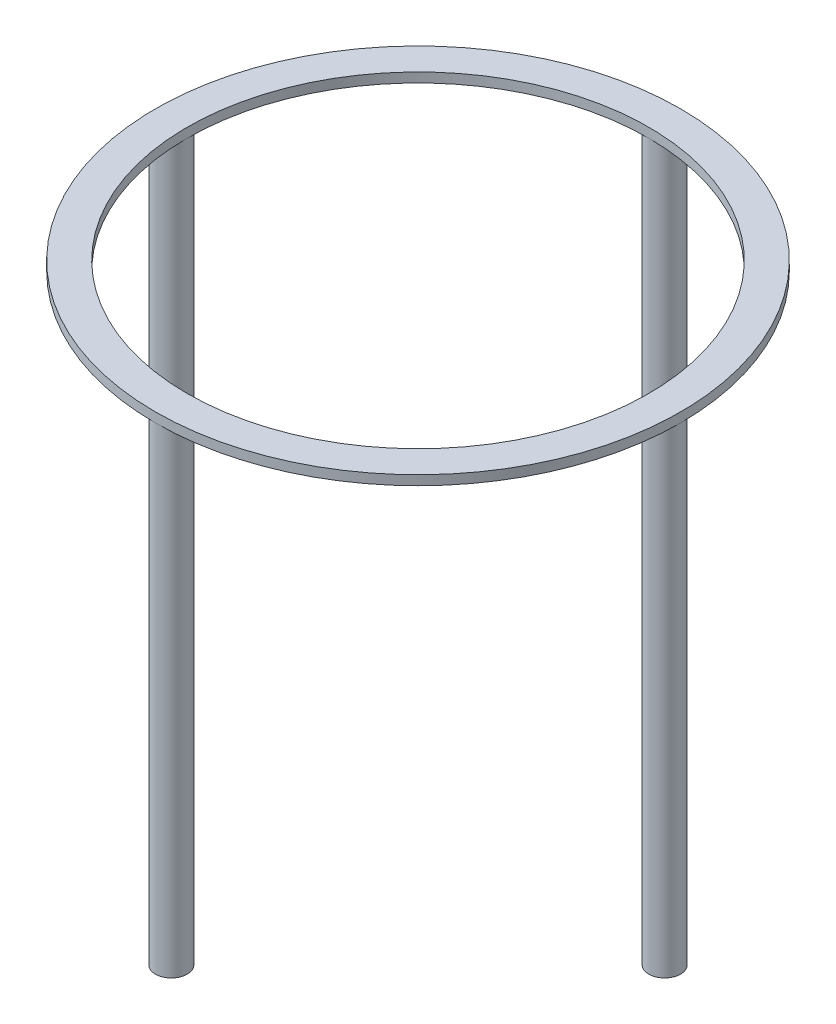
ISO-10303-21;
HEADER;
FILE_DESCRIPTION(('STEP AP214'),'2;1');
FILE_NAME('part.step','',(''),(''),'','','');
FILE_SCHEMA(('AUTOMOTIVE_DESIGN { 1 0 10303 214 1 1 1 1 }'));
ENDSEC;
DATA;
#1=APPLICATION_CONTEXT('core data for automotive mechanical design processes');
#2=APPLICATION_PROTOCOL_DEFINITION('international standard','automotive_design',2000,#1);
#3=PRODUCT_CONTEXT('',#1,'mechanical');
#4=PRODUCT('Part','Part','',(#3));
#5=PRODUCT_RELATED_PRODUCT_CATEGORY('part','',(#4));
#6=PRODUCT_DEFINITION_FORMATION('','',#4);
#7=PRODUCT_DEFINITION_CONTEXT('part definition',#1,'design');
#8=PRODUCT_DEFINITION('design','',#6,#7);
#9=PRODUCT_DEFINITION_SHAPE('','',#8);
#10=(LENGTH_UNIT() NAMED_UNIT(*) SI_UNIT(.MILLI.,.METRE.));
#11=(NAMED_UNIT(*) PLANE_ANGLE_UNIT() SI_UNIT($,.RADIAN.));
#12=(NAMED_UNIT(*) SI_UNIT($,.STERADIAN.) SOLID_ANGLE_UNIT());
#13=UNCERTAINTY_MEASURE_WITH_UNIT(LENGTH_MEASURE(1.E-05),#10,'distance_accuracy_value','');
#14=(GEOMETRIC_REPRESENTATION_CONTEXT(3) GLOBAL_UNCERTAINTY_ASSIGNED_CONTEXT((#13)) GLOBAL_UNIT_ASSIGNED_CONTEXT((#10,
#11,#12)) REPRESENTATION_CONTEXT('',''));
#15=CARTESIAN_POINT('',(0.,0.,0.));
#16=DIRECTION('',(0.,0.,1.));
#17=DIRECTION('',(1.,0.,0.));
#18=AXIS2_PLACEMENT_3D('',#15,#16,#17);
#19=CARTESIAN_POINT('',(0.,0.,0.));
#20=DIRECTION('',(0.,1.,0.));
#21=DIRECTION('',(0.,0.,1.));
#22=AXIS2_PLACEMENT_3D('',#19,#20,#21);
#23=PLANE('',#22);
#24=CARTESIAN_POINT('',(0.,0.,0.));
#25=DIRECTION('',(0.,1.,0.));
#26=DIRECTION('',(0.,0.,1.));
#27=AXIS2_PLACEMENT_3D('',#24,#25,#26);
#28=CIRCLE('',#27,72.5);
#29=CARTESIAN_POINT('',(0.,0.,-72.5));
#30=VERTEX_POINT('',#29);
#31=CARTESIAN_POINT('',(-72.5,0.,0.));
#32=VERTEX_POINT('',#31);
#33=EDGE_CURVE('E140',#30,#32,#28,.T.);
#34=ORIENTED_EDGE('',*,*,#33,.T.);
#35=CARTESIAN_POINT('',(-77.5,0.,0.));
#36=DIRECTION('',(0.,1.,0.));
#37=DIRECTION('',(0.,0.,1.));
#38=AXIS2_PLACEMENT_3D('',#35,#36,#37);
#39=CIRCLE('',#38,5.);
#40=CARTESIAN_POINT('',(-82.5,0.,0.));
#41=VERTEX_POINT('',#40);
#42=EDGE_CURVE('E54',#32,#41,#39,.T.);
#43=ORIENTED_EDGE('',*,*,#42,.T.);
#44=CARTESIAN_POINT('',(0.,0.,0.));
#45=DIRECTION('',(0.,1.,0.));
#46=DIRECTION('',(0.,0.,1.));
#47=AXIS2_PLACEMENT_3D('',#44,#45,#46);
#48=CIRCLE('',#47,82.5);
#49=CARTESIAN_POINT('',(0.,0.,-82.5));
#50=VERTEX_POINT('',#49);
#51=EDGE_CURVE('E104',#50,#41,#48,.T.);
#52=ORIENTED_EDGE('',*,*,#51,.F.);
#53=CARTESIAN_POINT('',(0.,0.,-77.5));
#54=DIRECTION('',(0.,1.,0.));
#55=DIRECTION('',(0.,0.,1.));
#56=AXIS2_PLACEMENT_3D('',#53,#54,#55);
#57=CIRCLE('',#56,5.);
#58=EDGE_CURVE('E82',#50,#30,#57,.T.);
#59=ORIENTED_EDGE('',*,*,#58,.T.);
#60=EDGE_LOOP('',(#34,#43,#52,#59));
#61=FACE_BOUND('',#60,.T.);
#62=ADVANCED_FACE('F42',(#61),#23,.F.);
#63=CARTESIAN_POINT('',(0.,0.,82.5));
#64=VERTEX_POINT('',#63);
#65=CARTESIAN_POINT('',(82.5,0.,0.));
#66=VERTEX_POINT('',#65);
#67=EDGE_CURVE('E48',#64,#66,#48,.T.);
#68=ORIENTED_EDGE('',*,*,#67,.F.);
#69=CARTESIAN_POINT('',(0.,0.,77.5));
#70=DIRECTION('',(0.,1.,0.));
#71=DIRECTION('',(0.,0.,1.));
#72=AXIS2_PLACEMENT_3D('',#69,#70,#71);
#73=CIRCLE('',#72,5.);
#74=CARTESIAN_POINT('',(0.,0.,72.5));
#75=VERTEX_POINT('',#74);
#76=EDGE_CURVE('E132',#64,#75,#73,.T.);
#77=ORIENTED_EDGE('',*,*,#76,.T.);
#78=CARTESIAN_POINT('',(72.5,0.,0.));
#79=VERTEX_POINT('',#78);
#80=EDGE_CURVE('E111',#75,#79,#28,.T.);
#81=ORIENTED_EDGE('',*,*,#80,.T.);
#82=CARTESIAN_POINT('',(77.5,0.,0.));
#83=DIRECTION('',(0.,1.,0.));
#84=DIRECTION('',(0.,0.,1.));
#85=AXIS2_PLACEMENT_3D('',#82,#83,#84);
#86=CIRCLE('',#85,5.);
#87=EDGE_CURVE('E90',#79,#66,#86,.T.);
#88=ORIENTED_EDGE('',*,*,#87,.T.);
#89=EDGE_LOOP('',(#68,#77,#81,#88));
#90=FACE_BOUND('',#89,.T.);
#91=ADVANCED_FACE('F146',(#90),#23,.F.);
#92=EDGE_CURVE('E98',#66,#50,#48,.T.);
#93=ORIENTED_EDGE('',*,*,#92,.F.);
#94=EDGE_CURVE('E127',#66,#79,#86,.T.);
#95=ORIENTED_EDGE('',*,*,#94,.T.);
#96=EDGE_CURVE('E101',#79,#30,#28,.T.);
#97=ORIENTED_EDGE('',*,*,#96,.T.);
#98=EDGE_CURVE('E68',#30,#50,#57,.T.);
#99=ORIENTED_EDGE('',*,*,#98,.T.);
#100=EDGE_LOOP('',(#93,#95,#97,#99));
#101=FACE_BOUND('',#100,.T.);
#102=ADVANCED_FACE('F92',(#101),#23,.F.);
#103=CARTESIAN_POINT('',(0.,3.,0.));
#104=DIRECTION('',(0.,1.,0.));
#105=DIRECTION('',(0.,0.,1.));
#106=AXIS2_PLACEMENT_3D('',#103,#104,#105);
#107=PLANE('',#106);
#108=CARTESIAN_POINT('',(0.,3.,0.));
#109=DIRECTION('',(0.,1.,0.));
#110=DIRECTION('',(0.,0.,1.));
#111=AXIS2_PLACEMENT_3D('',#108,#109,#110);
#112=CIRCLE('',#111,82.5);
#113=CARTESIAN_POINT('',(0.,3.,82.5));
#114=VERTEX_POINT('',#113);
#115=EDGE_CURVE('E89',#114,#114,#112,.T.);
#116=ORIENTED_EDGE('',*,*,#115,.T.);
#117=EDGE_LOOP('',(#116));
#118=FACE_BOUND('',#117,.T.);
#119=CARTESIAN_POINT('',(0.,3.,0.));
#120=DIRECTION('',(0.,1.,0.));
#121=DIRECTION('',(0.,0.,1.));
#122=AXIS2_PLACEMENT_3D('',#119,#120,#121);
#123=CIRCLE('',#122,72.5);
#124=CARTESIAN_POINT('',(0.,3.,72.5));
#125=VERTEX_POINT('',#124);
#126=EDGE_CURVE('E115',#125,#125,#123,.T.);
#127=ORIENTED_EDGE('',*,*,#126,.F.);
#128=EDGE_LOOP('',(#127));
#129=FACE_BOUND('',#128,.T.);
#130=ADVANCED_FACE('F174',(#118,#129),#107,.T.);
#131=EDGE_CURVE('E108',#41,#64,#48,.T.);
#132=ORIENTED_EDGE('',*,*,#131,.F.);
#133=EDGE_CURVE('E11',#41,#32,#39,.T.);
#134=ORIENTED_EDGE('',*,*,#133,.T.);
#135=EDGE_CURVE('E118',#32,#75,#28,.T.);
#136=ORIENTED_EDGE('',*,*,#135,.T.);
#137=EDGE_CURVE('E52',#75,#64,#73,.T.);
#138=ORIENTED_EDGE('',*,*,#137,.T.);
#139=EDGE_LOOP('',(#132,#134,#136,#138));
#140=FACE_BOUND('',#139,.T.);
#141=ADVANCED_FACE('F151',(#140),#23,.F.);
#142=CARTESIAN_POINT('',(0.,3.,0.));
#143=DIRECTION('',(0.,-1.,0.));
#144=DIRECTION('',(0.,0.,-1.));
#145=AXIS2_PLACEMENT_3D('',#142,#143,#144);
#146=CYLINDRICAL_SURFACE('',#145,82.5);
#147=ORIENTED_EDGE('',*,*,#115,.F.);
#148=EDGE_LOOP('',(#147));
#149=FACE_BOUND('',#148,.T.);
#150=ORIENTED_EDGE('',*,*,#67,.T.);
#151=ORIENTED_EDGE('',*,*,#92,.T.);
#152=ORIENTED_EDGE('',*,*,#51,.T.);
#153=ORIENTED_EDGE('',*,*,#131,.T.);
#154=EDGE_LOOP('',(#150,#151,#152,#153));
#155=FACE_BOUND('',#154,.T.);
#156=ADVANCED_FACE('F46',(#149,#155),#146,.T.);
#157=CARTESIAN_POINT('',(0.,3.,0.));
#158=DIRECTION('',(0.,-1.,0.));
#159=DIRECTION('',(0.,0.,-1.));
#160=AXIS2_PLACEMENT_3D('',#157,#158,#159);
#161=CYLINDRICAL_SURFACE('',#160,72.5);
#162=ORIENTED_EDGE('',*,*,#126,.T.);
#163=EDGE_LOOP('',(#162));
#164=FACE_BOUND('',#163,.T.);
#165=ORIENTED_EDGE('',*,*,#80,.F.);
#166=ORIENTED_EDGE('',*,*,#135,.F.);
#167=ORIENTED_EDGE('',*,*,#33,.F.);
#168=ORIENTED_EDGE('',*,*,#96,.F.);
#169=EDGE_LOOP('',(#165,#166,#167,#168));
#170=FACE_BOUND('',#169,.T.);
#171=ADVANCED_FACE('F144',(#164,#170),#161,.F.);
#172=CARTESIAN_POINT('',(0.,-150.,-77.5));
#173=DIRECTION('',(0.,1.,0.));
#174=DIRECTION('',(0.,0.,1.));
#175=AXIS2_PLACEMENT_3D('',#172,#173,#174);
#176=CYLINDRICAL_SURFACE('',#175,5.);
#177=CARTESIAN_POINT('',(0.,-150.,-77.5));
#178=DIRECTION('',(0.,1.,0.));
#179=DIRECTION('',(0.,0.,1.));
#180=AXIS2_PLACEMENT_3D('',#177,#178,#179);
#181=CIRCLE('',#180,5.);
#182=CARTESIAN_POINT('',(0.,-150.,-72.5));
#183=VERTEX_POINT('',#182);
#184=EDGE_CURVE('E103',#183,#183,#181,.T.);
#185=ORIENTED_EDGE('',*,*,#184,.T.);
#186=EDGE_LOOP('',(#185));
#187=FACE_BOUND('',#186,.T.);
#188=ORIENTED_EDGE('',*,*,#98,.F.);
#189=ORIENTED_EDGE('',*,*,#58,.F.);
#190=EDGE_LOOP('',(#188,#189));
#191=FACE_BOUND('',#190,.T.);
#192=ADVANCED_FACE('F85',(#187,#191),#176,.T.);
#193=CARTESIAN_POINT('',(0.,-150.,-77.5));
#194=DIRECTION('',(0.,1.,0.));
#195=DIRECTION('',(0.,0.,1.));
#196=AXIS2_PLACEMENT_3D('',#193,#194,#195);
#197=PLANE('',#196);
#198=ORIENTED_EDGE('',*,*,#184,.F.);
#199=EDGE_LOOP('',(#198));
#200=FACE_BOUND('',#199,.T.);
#201=ADVANCED_FACE('F199',(#200),#197,.F.);
#202=CARTESIAN_POINT('',(77.5,-150.,0.));
#203=DIRECTION('',(0.,1.,0.));
#204=DIRECTION('',(0.,0.,1.));
#205=AXIS2_PLACEMENT_3D('',#202,#203,#204);
#206=CYLINDRICAL_SURFACE('',#205,5.);
#207=CARTESIAN_POINT('',(77.5,-150.,0.));
#208=DIRECTION('',(0.,1.,0.));
#209=DIRECTION('',(0.,0.,1.));
#210=AXIS2_PLACEMENT_3D('',#207,#208,#209);
#211=CIRCLE('',#210,5.);
#212=CARTESIAN_POINT('',(77.5,-150.,5.));
#213=VERTEX_POINT('',#212);
#214=EDGE_CURVE('E105',#213,#213,#211,.T.);
#215=ORIENTED_EDGE('',*,*,#214,.T.);
#216=EDGE_LOOP('',(#215));
#217=FACE_BOUND('',#216,.T.);
#218=ORIENTED_EDGE('',*,*,#94,.F.);
#219=ORIENTED_EDGE('',*,*,#87,.F.);
#220=EDGE_LOOP('',(#218,#219));
#221=FACE_BOUND('',#220,.T.);
#222=ADVANCED_FACE('F207',(#217,#221),#206,.T.);
#223=CARTESIAN_POINT('',(77.5,-150.,0.));
#224=DIRECTION('',(0.,1.,0.));
#225=DIRECTION('',(0.,0.,1.));
#226=AXIS2_PLACEMENT_3D('',#223,#224,#225);
#227=PLANE('',#226);
#228=ORIENTED_EDGE('',*,*,#214,.F.);
#229=EDGE_LOOP('',(#228));
#230=FACE_BOUND('',#229,.T.);
#231=ADVANCED_FACE('F217',(#230),#227,.F.);
#232=CARTESIAN_POINT('',(0.,-150.,77.5));
#233=DIRECTION('',(0.,1.,0.));
#234=DIRECTION('',(0.,0.,1.));
#235=AXIS2_PLACEMENT_3D('',#232,#233,#234);
#236=CYLINDRICAL_SURFACE('',#235,5.);
#237=CARTESIAN_POINT('',(0.,-150.,77.5));
#238=DIRECTION('',(0.,1.,0.));
#239=DIRECTION('',(0.,0.,1.));
#240=AXIS2_PLACEMENT_3D('',#237,#238,#239);
#241=CIRCLE('',#240,5.);
#242=CARTESIAN_POINT('',(0.,-150.,82.5));
#243=VERTEX_POINT('',#242);
#244=EDGE_CURVE('E126',#243,#243,#241,.T.);
#245=ORIENTED_EDGE('',*,*,#244,.T.);
#246=EDGE_LOOP('',(#245));
#247=FACE_BOUND('',#246,.T.);
#248=ORIENTED_EDGE('',*,*,#76,.F.);
#249=ORIENTED_EDGE('',*,*,#137,.F.);
#250=EDGE_LOOP('',(#248,#249));
#251=FACE_BOUND('',#250,.T.);
#252=ADVANCED_FACE('F147',(#247,#251),#236,.T.);
#253=CARTESIAN_POINT('',(0.,-150.,77.5));
#254=DIRECTION('',(0.,1.,0.));
#255=DIRECTION('',(0.,0.,1.));
#256=AXIS2_PLACEMENT_3D('',#253,#254,#255);
#257=PLANE('',#256);
#258=ORIENTED_EDGE('',*,*,#244,.F.);
#259=EDGE_LOOP('',(#258));
#260=FACE_BOUND('',#259,.T.);
#261=ADVANCED_FACE('F154',(#260),#257,.F.);
#262=CARTESIAN_POINT('',(-77.5,-150.,0.));
#263=DIRECTION('',(0.,1.,0.));
#264=DIRECTION('',(0.,0.,1.));
#265=AXIS2_PLACEMENT_3D('',#262,#263,#264);
#266=CYLINDRICAL_SURFACE('',#265,5.);
#267=CARTESIAN_POINT('',(-77.5,-150.,0.));
#268=DIRECTION('',(0.,1.,0.));
#269=DIRECTION('',(0.,0.,1.));
#270=AXIS2_PLACEMENT_3D('',#267,#268,#269);
#271=CIRCLE('',#270,5.);
#272=CARTESIAN_POINT('',(-77.5,-150.,5.00000000000001));
#273=VERTEX_POINT('',#272);
#274=EDGE_CURVE('E131',#273,#273,#271,.T.);
#275=ORIENTED_EDGE('',*,*,#274,.T.);
#276=EDGE_LOOP('',(#275));
#277=FACE_BOUND('',#276,.T.);
#278=ORIENTED_EDGE('',*,*,#42,.F.);
#279=ORIENTED_EDGE('',*,*,#133,.F.);
#280=EDGE_LOOP('',(#278,#279));
#281=FACE_BOUND('',#280,.T.);
#282=ADVANCED_FACE('F155',(#277,#281),#266,.T.);
#283=CARTESIAN_POINT('',(-77.5,-150.,0.));
#284=DIRECTION('',(0.,1.,0.));
#285=DIRECTION('',(0.,0.,1.));
#286=AXIS2_PLACEMENT_3D('',#283,#284,#285);
#287=PLANE('',#286);
#288=ORIENTED_EDGE('',*,*,#274,.F.);
#289=EDGE_LOOP('',(#288));
#290=FACE_BOUND('',#289,.T.);
#291=ADVANCED_FACE('F152',(#290),#287,.F.);
#292=CLOSED_SHELL('',(#62,#91,#102,#130,#141,#156,#171,#192,#201,#222,#231,#252,#261,#282,#291));
#293=MANIFOLD_SOLID_BREP('B2',#292);
#294=ADVANCED_BREP_SHAPE_REPRESENTATION('',(#18,#293),#14);
#295=SHAPE_DEFINITION_REPRESENTATION(#9,#294);
ENDSEC;
END-ISO-10303-21;
